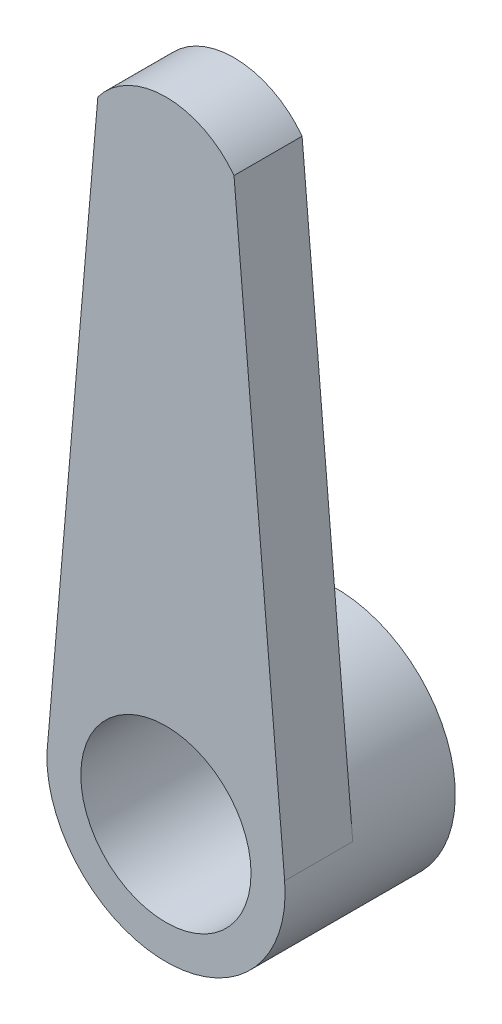
ISO-10303-21;
HEADER;
FILE_DESCRIPTION(('STEP AP214'),'2;1');
FILE_NAME('part.step','',(''),(''),'','','');
FILE_SCHEMA(('AUTOMOTIVE_DESIGN { 1 0 10303 214 1 1 1 1 }'));
ENDSEC;
DATA;
#1=APPLICATION_CONTEXT('core data for automotive mechanical design processes');
#2=APPLICATION_PROTOCOL_DEFINITION('international standard','automotive_design',2000,#1);
#3=PRODUCT_CONTEXT('',#1,'mechanical');
#4=PRODUCT('Part','Part','',(#3));
#5=PRODUCT_RELATED_PRODUCT_CATEGORY('part','',(#4));
#6=PRODUCT_DEFINITION_FORMATION('','',#4);
#7=PRODUCT_DEFINITION_CONTEXT('part definition',#1,'design');
#8=PRODUCT_DEFINITION('design','',#6,#7);
#9=PRODUCT_DEFINITION_SHAPE('','',#8);
#10=(LENGTH_UNIT() NAMED_UNIT(*) SI_UNIT(.MILLI.,.METRE.));
#11=(NAMED_UNIT(*) PLANE_ANGLE_UNIT() SI_UNIT($,.RADIAN.));
#12=(NAMED_UNIT(*) SI_UNIT($,.STERADIAN.) SOLID_ANGLE_UNIT());
#13=UNCERTAINTY_MEASURE_WITH_UNIT(LENGTH_MEASURE(1.E-05),#10,'distance_accuracy_value','');
#14=(GEOMETRIC_REPRESENTATION_CONTEXT(3) GLOBAL_UNCERTAINTY_ASSIGNED_CONTEXT((#13)) GLOBAL_UNIT_ASSIGNED_CONTEXT((#10,
#11,#12)) REPRESENTATION_CONTEXT('',''));
#15=CARTESIAN_POINT('',(0.,0.,0.));
#16=DIRECTION('',(0.,0.,1.));
#17=DIRECTION('',(1.,0.,0.));
#18=AXIS2_PLACEMENT_3D('',#15,#16,#17);
#19=CARTESIAN_POINT('',(2.74349546450437,8.90074337548521,-2.));
#20=DIRECTION('',(-0.996283122573928,-0.0861390717058368,0.));
#21=DIRECTION('',(0.0861390717058368,-0.996283122573928,0.));
#22=AXIS2_PLACEMENT_3D('',#19,#20,#21);
#23=PLANE('',#22);
#24=DIRECTION('',(0.0861390717058368,-0.996283122573928,0.));
#25=VECTOR('',#24,1.);
#26=CARTESIAN_POINT('',(2.74349546450437,8.90074337548521,0.));
#27=LINE('',#26,#25);
#28=CARTESIAN_POINT('',(2.,17.5,0.));
#29=VERTEX_POINT('',#28);
#30=CARTESIAN_POINT('',(3.48699092900875,0.301486750970428,0.));
#31=VERTEX_POINT('',#30);
#32=EDGE_CURVE('E11',#29,#31,#27,.T.);
#33=ORIENTED_EDGE('',*,*,#32,.T.);
#34=DIRECTION('',(0.,0.,1.));
#35=VECTOR('',#34,1.);
#36=CARTESIAN_POINT('',(3.48699092900875,0.301486750970428,-2.));
#37=LINE('',#36,#35);
#38=CARTESIAN_POINT('',(3.48699092900875,0.301486750970427,-2.));
#39=VERTEX_POINT('',#38);
#40=EDGE_CURVE('E24',#39,#31,#37,.T.);
#41=ORIENTED_EDGE('',*,*,#40,.F.);
#42=DIRECTION('',(0.0861390717058368,-0.996283122573928,0.));
#43=VECTOR('',#42,1.);
#44=CARTESIAN_POINT('',(2.74349546450437,8.90074337548521,-2.));
#45=LINE('',#44,#43);
#46=CARTESIAN_POINT('',(2.,17.5,-2.));
#47=VERTEX_POINT('',#46);
#48=EDGE_CURVE('E99',#47,#39,#45,.T.);
#49=ORIENTED_EDGE('',*,*,#48,.F.);
#50=DIRECTION('',(0.,0.,1.));
#51=VECTOR('',#50,1.);
#52=CARTESIAN_POINT('',(2.,17.5,-2.));
#53=LINE('',#52,#51);
#54=EDGE_CURVE('E97',#47,#29,#53,.T.);
#55=ORIENTED_EDGE('',*,*,#54,.T.);
#56=EDGE_LOOP('',(#33,#41,#49,#55));
#57=FACE_BOUND('',#56,.T.);
#58=ADVANCED_FACE('F17',(#57),#23,.F.);
#59=CARTESIAN_POINT('',(0.,16.,-2.));
#60=DIRECTION('',(0.,0.,1.));
#61=DIRECTION('',(1.,0.,0.));
#62=AXIS2_PLACEMENT_3D('',#59,#60,#61);
#63=CYLINDRICAL_SURFACE('',#62,2.5);
#64=CARTESIAN_POINT('',(0.,16.,0.));
#65=DIRECTION('',(0.,0.,1.));
#66=DIRECTION('',(1.,0.,0.));
#67=AXIS2_PLACEMENT_3D('',#64,#65,#66);
#68=CIRCLE('',#67,2.5);
#69=CARTESIAN_POINT('',(-2.,17.5,0.));
#70=VERTEX_POINT('',#69);
#71=EDGE_CURVE('E94',#29,#70,#68,.T.);
#72=ORIENTED_EDGE('',*,*,#71,.F.);
#73=ORIENTED_EDGE('',*,*,#54,.F.);
#74=CARTESIAN_POINT('',(0.,16.,-2.));
#75=DIRECTION('',(0.,0.,1.));
#76=DIRECTION('',(1.,0.,0.));
#77=AXIS2_PLACEMENT_3D('',#74,#75,#76);
#78=CIRCLE('',#77,2.5);
#79=CARTESIAN_POINT('',(-2.,17.5,-2.));
#80=VERTEX_POINT('',#79);
#81=EDGE_CURVE('E92',#47,#80,#78,.T.);
#82=ORIENTED_EDGE('',*,*,#81,.T.);
#83=DIRECTION('',(0.,0.,1.));
#84=VECTOR('',#83,1.);
#85=CARTESIAN_POINT('',(-2.,17.5,-2.));
#86=LINE('',#85,#84);
#87=EDGE_CURVE('E75',#80,#70,#86,.T.);
#88=ORIENTED_EDGE('',*,*,#87,.T.);
#89=EDGE_LOOP('',(#72,#73,#82,#88));
#90=FACE_BOUND('',#89,.T.);
#91=ADVANCED_FACE('F112',(#90),#63,.T.);
#92=CARTESIAN_POINT('',(-2.72447325769854,9.04781199351701,-2.));
#93=DIRECTION('',(-0.996346649041751,0.0854011413464357,0.));
#94=DIRECTION('',(-0.0854011413464357,-0.996346649041751,0.));
#95=AXIS2_PLACEMENT_3D('',#92,#93,#94);
#96=PLANE('',#95);
#97=DIRECTION('',(0.,0.,1.));
#98=VECTOR('',#97,1.);
#99=CARTESIAN_POINT('',(-3.5,0.,-2.));
#100=LINE('',#99,#98);
#101=CARTESIAN_POINT('',(-3.5,0.,-5.));
#102=VERTEX_POINT('',#101);
#103=CARTESIAN_POINT('',(-3.5,0.,0.));
#104=VERTEX_POINT('',#103);
#105=EDGE_CURVE('E61',#102,#104,#100,.T.);
#106=ORIENTED_EDGE('',*,*,#105,.T.);
#107=DIRECTION('',(-0.0854011413464357,-0.996346649041751,0.));
#108=VECTOR('',#107,1.);
#109=CARTESIAN_POINT('',(-2.72447325769854,9.04781199351701,0.));
#110=LINE('',#109,#108);
#111=EDGE_CURVE('E76',#70,#104,#110,.T.);
#112=ORIENTED_EDGE('',*,*,#111,.F.);
#113=ORIENTED_EDGE('',*,*,#87,.F.);
#114=DIRECTION('',(-0.0854011413464357,-0.996346649041751,0.));
#115=VECTOR('',#114,1.);
#116=CARTESIAN_POINT('',(-2.72447325769854,9.04781199351701,-2.));
#117=LINE('',#116,#115);
#118=CARTESIAN_POINT('',(-3.44894651539708,0.59562398703403,-2.));
#119=VERTEX_POINT('',#118);
#120=EDGE_CURVE('E88',#80,#119,#117,.T.);
#121=ORIENTED_EDGE('',*,*,#120,.T.);
#122=DIRECTION('',(0.,0.,1.));
#123=VECTOR('',#122,1.);
#124=CARTESIAN_POINT('',(-3.44894651539708,0.59562398703403,-5.));
#125=LINE('',#124,#123);
#126=CARTESIAN_POINT('',(-3.44894651539708,0.59562398703403,-5.));
#127=VERTEX_POINT('',#126);
#128=EDGE_CURVE('E64',#127,#119,#125,.T.);
#129=ORIENTED_EDGE('',*,*,#128,.F.);
#130=DIRECTION('',(-0.0854011413464358,-0.996346649041751,0.));
#131=VECTOR('',#130,1.);
#132=CARTESIAN_POINT('',(-3.47447325769854,0.297811993517009,-5.));
#133=LINE('',#132,#131);
#134=EDGE_CURVE('E57',#127,#102,#133,.T.);
#135=ORIENTED_EDGE('',*,*,#134,.T.);
#136=EDGE_LOOP('',(#106,#112,#113,#121,#129,#135));
#137=FACE_BOUND('',#136,.T.);
#138=ADVANCED_FACE('F59',(#137),#96,.T.);
#139=CARTESIAN_POINT('',(0.,0.,-2.));
#140=DIRECTION('',(0.,0.,1.));
#141=DIRECTION('',(1.,0.,0.));
#142=AXIS2_PLACEMENT_3D('',#139,#140,#141);
#143=CYLINDRICAL_SURFACE('',#142,3.5);
#144=CARTESIAN_POINT('',(0.,0.,0.));
#145=DIRECTION('',(0.,0.,1.));
#146=DIRECTION('',(1.,0.,0.));
#147=AXIS2_PLACEMENT_3D('',#144,#145,#146);
#148=CIRCLE('',#147,3.5);
#149=EDGE_CURVE('E68',#104,#31,#148,.T.);
#150=ORIENTED_EDGE('',*,*,#149,.F.);
#151=ORIENTED_EDGE('',*,*,#105,.F.);
#152=CARTESIAN_POINT('',(0.,0.,-5.));
#153=DIRECTION('',(0.,0.,1.));
#154=DIRECTION('',(1.,0.,0.));
#155=AXIS2_PLACEMENT_3D('',#152,#153,#154);
#156=CIRCLE('',#155,3.5);
#157=EDGE_CURVE('E72',#102,#127,#156,.T.);
#158=ORIENTED_EDGE('',*,*,#157,.T.);
#159=ORIENTED_EDGE('',*,*,#128,.T.);
#160=CARTESIAN_POINT('',(0.,0.,-2.));
#161=DIRECTION('',(0.,0.,1.));
#162=DIRECTION('',(1.,0.,0.));
#163=AXIS2_PLACEMENT_3D('',#160,#161,#162);
#164=CIRCLE('',#163,3.5);
#165=EDGE_CURVE('E79',#39,#119,#164,.T.);
#166=ORIENTED_EDGE('',*,*,#165,.F.);
#167=ORIENTED_EDGE('',*,*,#40,.T.);
#168=EDGE_LOOP('',(#150,#151,#158,#159,#166,#167));
#169=FACE_BOUND('',#168,.T.);
#170=ADVANCED_FACE('F71',(#169),#143,.T.);
#171=CARTESIAN_POINT('',(0.,0.,-2.));
#172=DIRECTION('',(0.,0.,1.));
#173=DIRECTION('',(1.,0.,0.));
#174=AXIS2_PLACEMENT_3D('',#171,#172,#173);
#175=CYLINDRICAL_SURFACE('',#174,2.5);
#176=CARTESIAN_POINT('',(0.,0.,0.));
#177=DIRECTION('',(0.,0.,1.));
#178=DIRECTION('',(1.,0.,0.));
#179=AXIS2_PLACEMENT_3D('',#176,#177,#178);
#180=CIRCLE('',#179,2.5);
#181=CARTESIAN_POINT('',(2.5,0.,0.));
#182=VERTEX_POINT('',#181);
#183=EDGE_CURVE('E83',#182,#182,#180,.T.);
#184=ORIENTED_EDGE('',*,*,#183,.T.);
#185=EDGE_LOOP('',(#184));
#186=FACE_BOUND('',#185,.T.);
#187=CARTESIAN_POINT('',(0.,0.,-5.));
#188=DIRECTION('',(0.,0.,1.));
#189=DIRECTION('',(1.,0.,0.));
#190=AXIS2_PLACEMENT_3D('',#187,#188,#189);
#191=CIRCLE('',#190,2.5);
#192=CARTESIAN_POINT('',(2.5,0.,-5.));
#193=VERTEX_POINT('',#192);
#194=EDGE_CURVE('E138',#193,#193,#191,.T.);
#195=ORIENTED_EDGE('',*,*,#194,.F.);
#196=EDGE_LOOP('',(#195));
#197=FACE_BOUND('',#196,.T.);
#198=ADVANCED_FACE('F124',(#186,#197),#175,.F.);
#199=CARTESIAN_POINT('',(0.00652880225333972,7.5,-2.));
#200=DIRECTION('',(0.,0.,1.));
#201=DIRECTION('',(1.,0.,0.));
#202=AXIS2_PLACEMENT_3D('',#199,#200,#201);
#203=PLANE('',#202);
#204=ORIENTED_EDGE('',*,*,#48,.T.);
#205=ORIENTED_EDGE('',*,*,#165,.T.);
#206=ORIENTED_EDGE('',*,*,#120,.F.);
#207=ORIENTED_EDGE('',*,*,#81,.F.);
#208=EDGE_LOOP('',(#204,#205,#206,#207));
#209=FACE_BOUND('',#208,.T.);
#210=ADVANCED_FACE('F110',(#209),#203,.F.);
#211=CARTESIAN_POINT('',(0.00652880225333972,7.5,0.));
#212=DIRECTION('',(0.,0.,1.));
#213=DIRECTION('',(1.,0.,0.));
#214=AXIS2_PLACEMENT_3D('',#211,#212,#213);
#215=PLANE('',#214);
#216=ORIENTED_EDGE('',*,*,#111,.T.);
#217=ORIENTED_EDGE('',*,*,#149,.T.);
#218=ORIENTED_EDGE('',*,*,#32,.F.);
#219=ORIENTED_EDGE('',*,*,#71,.T.);
#220=EDGE_LOOP('',(#216,#217,#218,#219));
#221=FACE_BOUND('',#220,.T.);
#222=ORIENTED_EDGE('',*,*,#183,.F.);
#223=EDGE_LOOP('',(#222));
#224=FACE_BOUND('',#223,.T.);
#225=ADVANCED_FACE('F102',(#221,#224),#215,.T.);
#226=CARTESIAN_POINT('',(0.00652880225333972,7.5,-5.));
#227=DIRECTION('',(0.,0.,1.));
#228=DIRECTION('',(1.,0.,0.));
#229=AXIS2_PLACEMENT_3D('',#226,#227,#228);
#230=PLANE('',#229);
#231=ORIENTED_EDGE('',*,*,#194,.T.);
#232=EDGE_LOOP('',(#231));
#233=FACE_BOUND('',#232,.T.);
#234=ORIENTED_EDGE('',*,*,#157,.F.);
#235=ORIENTED_EDGE('',*,*,#134,.F.);
#236=EDGE_LOOP('',(#234,#235));
#237=FACE_BOUND('',#236,.T.);
#238=ADVANCED_FACE('F78',(#233,#237),#230,.F.);
#239=CLOSED_SHELL('',(#58,#91,#138,#170,#198,#210,#225,#238));
#240=MANIFOLD_SOLID_BREP('B1',#239);
#241=ADVANCED_BREP_SHAPE_REPRESENTATION('',(#18,#240),#14);
#242=SHAPE_DEFINITION_REPRESENTATION(#9,#241);
ENDSEC;
END-ISO-10303-21;
